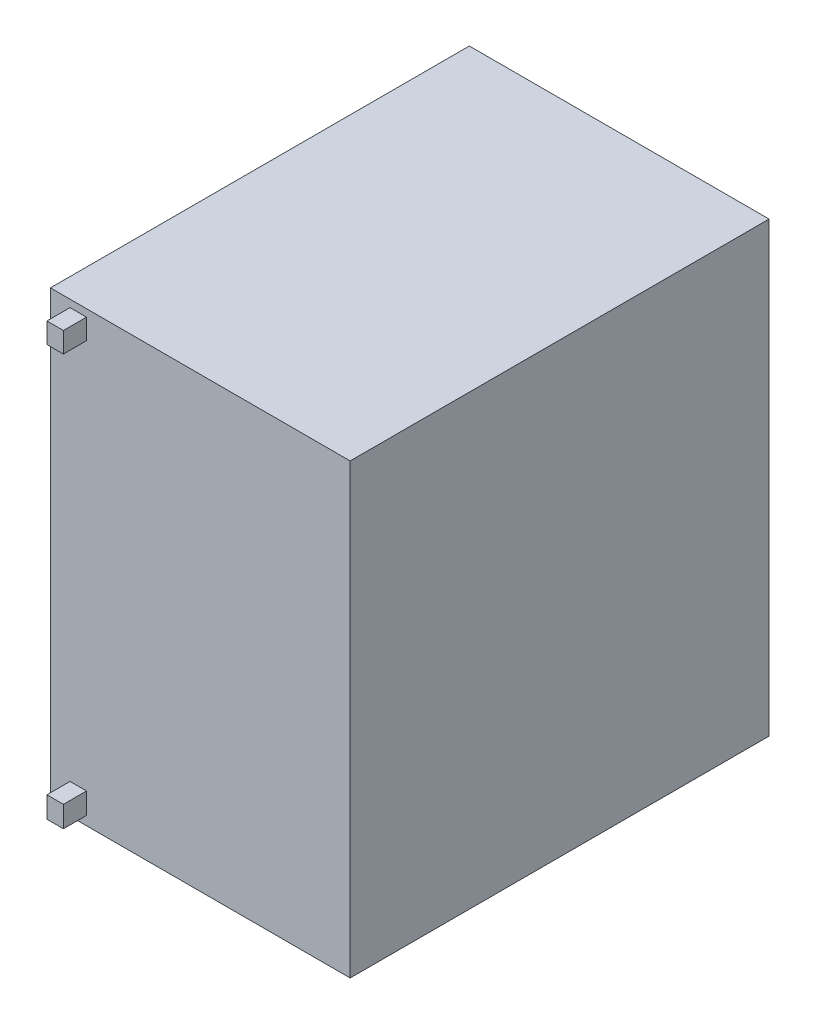
ISO-10303-21;
HEADER;
FILE_DESCRIPTION(('STEP AP214'),'2;1');
FILE_NAME('part.step','',(''),(''),'','','');
FILE_SCHEMA(('AUTOMOTIVE_DESIGN { 1 0 10303 214 1 1 1 1 }'));
ENDSEC;
DATA;
#1=APPLICATION_CONTEXT('core data for automotive mechanical design processes');
#2=APPLICATION_PROTOCOL_DEFINITION('international standard','automotive_design',2000,#1);
#3=PRODUCT_CONTEXT('',#1,'mechanical');
#4=PRODUCT('Part','Part','',(#3));
#5=PRODUCT_RELATED_PRODUCT_CATEGORY('part','',(#4));
#6=PRODUCT_DEFINITION_FORMATION('','',#4);
#7=PRODUCT_DEFINITION_CONTEXT('part definition',#1,'design');
#8=PRODUCT_DEFINITION('design','',#6,#7);
#9=PRODUCT_DEFINITION_SHAPE('','',#8);
#10=(LENGTH_UNIT() NAMED_UNIT(*) SI_UNIT(.MILLI.,.METRE.));
#11=(NAMED_UNIT(*) PLANE_ANGLE_UNIT() SI_UNIT($,.RADIAN.));
#12=(NAMED_UNIT(*) SI_UNIT($,.STERADIAN.) SOLID_ANGLE_UNIT());
#13=UNCERTAINTY_MEASURE_WITH_UNIT(LENGTH_MEASURE(1.E-05),#10,'distance_accuracy_value','');
#14=(GEOMETRIC_REPRESENTATION_CONTEXT(3) GLOBAL_UNCERTAINTY_ASSIGNED_CONTEXT((#13)) GLOBAL_UNIT_ASSIGNED_CONTEXT((#10,
#11,#12)) REPRESENTATION_CONTEXT('',''));
#15=CARTESIAN_POINT('',(0.,0.,0.));
#16=DIRECTION('',(0.,0.,1.));
#17=DIRECTION('',(1.,0.,0.));
#18=AXIS2_PLACEMENT_3D('',#15,#16,#17);
#19=CARTESIAN_POINT('',(118.999,-63.5,75.692));
#20=DIRECTION('',(0.,0.,-1.));
#21=DIRECTION('',(-1.,0.,0.));
#22=AXIS2_PLACEMENT_3D('',#19,#20,#21);
#23=PLANE('',#22);
#24=DIRECTION('',(0.,-1.,0.));
#25=VECTOR('',#24,1.);
#26=CARTESIAN_POINT('',(-4.13983068573411,-75.6791151301606,75.692));
#27=LINE('',#26,#25);
#28=CARTESIAN_POINT('',(-4.13983068573411,-66.7114378730985,75.692));
#29=VERTEX_POINT('',#28);
#30=CARTESIAN_POINT('',(-4.13983068573411,-75.6791151301606,75.692));
#31=VERTEX_POINT('',#30);
#32=EDGE_CURVE('E149',#29,#31,#27,.T.);
#33=ORIENTED_EDGE('',*,*,#32,.F.);
#34=DIRECTION('',(-1.,0.,0.));
#35=VECTOR('',#34,1.);
#36=CARTESIAN_POINT('',(-4.13983068573411,-66.7114378730985,75.692));
#37=LINE('',#36,#35);
#38=CARTESIAN_POINT('',(3.10329325266238,-66.7114378730985,75.692));
#39=VERTEX_POINT('',#38);
#40=EDGE_CURVE('E162',#39,#29,#37,.T.);
#41=ORIENTED_EDGE('',*,*,#40,.F.);
#42=DIRECTION('',(0.,1.,0.));
#43=VECTOR('',#42,1.);
#44=CARTESIAN_POINT('',(3.10329325266238,-75.6791151301606,75.692));
#45=LINE('',#44,#43);
#46=CARTESIAN_POINT('',(3.10329325266238,-75.6791151301606,75.692));
#47=VERTEX_POINT('',#46);
#48=EDGE_CURVE('E171',#47,#39,#45,.T.);
#49=ORIENTED_EDGE('',*,*,#48,.F.);
#50=DIRECTION('',(1.,0.,0.));
#51=VECTOR('',#50,1.);
#52=CARTESIAN_POINT('',(-4.13983068573411,-75.6791151301606,75.692));
#53=LINE('',#52,#51);
#54=EDGE_CURVE('E152',#31,#47,#53,.T.);
#55=ORIENTED_EDGE('',*,*,#54,.F.);
#56=EDGE_LOOP('',(#33,#41,#49,#55));
#57=FACE_BOUND('',#56,.T.);
#58=DIRECTION('',(1.,0.,0.));
#59=VECTOR('',#58,1.);
#60=CARTESIAN_POINT('',(118.999,-260.35,75.692));
#61=LINE('',#60,#59);
#62=CARTESIAN_POINT('',(-12.7635,-260.35,75.692));
#63=VERTEX_POINT('',#62);
#64=CARTESIAN_POINT('',(118.999,-260.35,75.692));
#65=VERTEX_POINT('',#64);
#66=EDGE_CURVE('E192',#63,#65,#61,.T.);
#67=ORIENTED_EDGE('',*,*,#66,.T.);
#68=DIRECTION('',(0.,-1.,0.));
#69=VECTOR('',#68,1.);
#70=CARTESIAN_POINT('',(118.999,-63.5,75.692));
#71=LINE('',#70,#69);
#72=CARTESIAN_POINT('',(118.999,-63.5,75.692));
#73=VERTEX_POINT('',#72);
#74=EDGE_CURVE('E198',#73,#65,#71,.T.);
#75=ORIENTED_EDGE('',*,*,#74,.F.);
#76=DIRECTION('',(1.,0.,0.));
#77=VECTOR('',#76,1.);
#78=CARTESIAN_POINT('',(118.999,-63.5,75.692));
#79=LINE('',#78,#77);
#80=CARTESIAN_POINT('',(-12.7635,-63.5,75.692));
#81=VERTEX_POINT('',#80);
#82=EDGE_CURVE('E196',#81,#73,#79,.T.);
#83=ORIENTED_EDGE('',*,*,#82,.F.);
#84=DIRECTION('',(0.,-1.,0.));
#85=VECTOR('',#84,1.);
#86=CARTESIAN_POINT('',(-12.7635,-63.5,75.692));
#87=LINE('',#86,#85);
#88=EDGE_CURVE('E208',#81,#63,#87,.T.);
#89=ORIENTED_EDGE('',*,*,#88,.T.);
#90=EDGE_LOOP('',(#67,#75,#83,#89));
#91=FACE_BOUND('',#90,.T.);
#92=DIRECTION('',(0.,-1.,0.));
#93=VECTOR('',#92,1.);
#94=CARTESIAN_POINT('',(-4.13983068573411,-256.412302926337,75.692));
#95=LINE('',#94,#93);
#96=CARTESIAN_POINT('',(-4.13983068573411,-247.099715005542,75.692));
#97=VERTEX_POINT('',#96);
#98=CARTESIAN_POINT('',(-4.13983068573411,-256.412302926337,75.692));
#99=VERTEX_POINT('',#98);
#100=EDGE_CURVE('E148',#97,#99,#95,.T.);
#101=ORIENTED_EDGE('',*,*,#100,.F.);
#102=DIRECTION('',(-1.,0.,0.));
#103=VECTOR('',#102,1.);
#104=CARTESIAN_POINT('',(-4.13983068573411,-247.099715005542,75.692));
#105=LINE('',#104,#103);
#106=CARTESIAN_POINT('',(3.10329325266238,-247.099715005542,75.692));
#107=VERTEX_POINT('',#106);
#108=EDGE_CURVE('E145',#107,#97,#105,.T.);
#109=ORIENTED_EDGE('',*,*,#108,.F.);
#110=DIRECTION('',(0.,1.,0.));
#111=VECTOR('',#110,1.);
#112=CARTESIAN_POINT('',(3.10329325266238,-256.412302926337,75.692));
#113=LINE('',#112,#111);
#114=CARTESIAN_POINT('',(3.10329325266238,-256.412302926337,75.692));
#115=VERTEX_POINT('',#114);
#116=EDGE_CURVE('E59',#115,#107,#113,.T.);
#117=ORIENTED_EDGE('',*,*,#116,.F.);
#118=DIRECTION('',(1.,0.,0.));
#119=VECTOR('',#118,1.);
#120=CARTESIAN_POINT('',(-4.13983068573411,-256.412302926337,75.692));
#121=LINE('',#120,#119);
#122=EDGE_CURVE('E54',#99,#115,#121,.T.);
#123=ORIENTED_EDGE('',*,*,#122,.F.);
#124=EDGE_LOOP('',(#101,#109,#117,#123));
#125=FACE_BOUND('',#124,.T.);
#126=ADVANCED_FACE('F39',(#57,#91,#125),#23,.F.);
#127=CARTESIAN_POINT('',(118.999,-63.5,-108.458));
#128=DIRECTION('',(-1.,0.,0.));
#129=DIRECTION('',(0.,0.,1.));
#130=AXIS2_PLACEMENT_3D('',#127,#128,#129);
#131=PLANE('',#130);
#132=DIRECTION('',(0.,0.,-1.));
#133=VECTOR('',#132,1.);
#134=CARTESIAN_POINT('',(118.999,-260.35,-108.458));
#135=LINE('',#134,#133);
#136=CARTESIAN_POINT('',(118.999,-260.35,-108.458));
#137=VERTEX_POINT('',#136);
#138=EDGE_CURVE('E187',#65,#137,#135,.T.);
#139=ORIENTED_EDGE('',*,*,#138,.T.);
#140=DIRECTION('',(0.,-1.,0.));
#141=VECTOR('',#140,1.);
#142=CARTESIAN_POINT('',(118.999,-63.5,-108.458));
#143=LINE('',#142,#141);
#144=CARTESIAN_POINT('',(118.999,-63.5,-108.458));
#145=VERTEX_POINT('',#144);
#146=EDGE_CURVE('E11',#145,#137,#143,.T.);
#147=ORIENTED_EDGE('',*,*,#146,.F.);
#148=DIRECTION('',(0.,0.,-1.));
#149=VECTOR('',#148,1.);
#150=CARTESIAN_POINT('',(118.999,-63.5,-108.458));
#151=LINE('',#150,#149);
#152=EDGE_CURVE('E188',#73,#145,#151,.T.);
#153=ORIENTED_EDGE('',*,*,#152,.F.);
#154=ORIENTED_EDGE('',*,*,#74,.T.);
#155=EDGE_LOOP('',(#139,#147,#153,#154));
#156=FACE_BOUND('',#155,.T.);
#157=ADVANCED_FACE('F41',(#156),#131,.F.);
#158=CARTESIAN_POINT('',(118.999,-63.5,-108.458));
#159=DIRECTION('',(0.,0.,1.));
#160=DIRECTION('',(1.,0.,0.));
#161=AXIS2_PLACEMENT_3D('',#158,#159,#160);
#162=PLANE('',#161);
#163=DIRECTION('',(-1.,0.,0.));
#164=VECTOR('',#163,1.);
#165=CARTESIAN_POINT('',(118.999,-260.35,-108.458));
#166=LINE('',#165,#164);
#167=CARTESIAN_POINT('',(-12.7635,-260.35,-108.458));
#168=VERTEX_POINT('',#167);
#169=EDGE_CURVE('E201',#137,#168,#166,.T.);
#170=ORIENTED_EDGE('',*,*,#169,.T.);
#171=DIRECTION('',(0.,-1.,0.));
#172=VECTOR('',#171,1.);
#173=CARTESIAN_POINT('',(-12.7635,-63.5,-108.458));
#174=LINE('',#173,#172);
#175=CARTESIAN_POINT('',(-12.7635,-63.5,-108.458));
#176=VERTEX_POINT('',#175);
#177=EDGE_CURVE('E47',#176,#168,#174,.T.);
#178=ORIENTED_EDGE('',*,*,#177,.F.);
#179=DIRECTION('',(-1.,0.,0.));
#180=VECTOR('',#179,1.);
#181=CARTESIAN_POINT('',(118.999,-63.5,-108.458));
#182=LINE('',#181,#180);
#183=EDGE_CURVE('E191',#145,#176,#182,.T.);
#184=ORIENTED_EDGE('',*,*,#183,.F.);
#185=ORIENTED_EDGE('',*,*,#146,.T.);
#186=EDGE_LOOP('',(#170,#178,#184,#185));
#187=FACE_BOUND('',#186,.T.);
#188=ADVANCED_FACE('F230',(#187),#162,.F.);
#189=CARTESIAN_POINT('',(-12.7635,-63.5,-108.458));
#190=DIRECTION('',(1.,0.,0.));
#191=DIRECTION('',(0.,0.,-1.));
#192=AXIS2_PLACEMENT_3D('',#189,#190,#191);
#193=PLANE('',#192);
#194=DIRECTION('',(0.,0.,1.));
#195=VECTOR('',#194,1.);
#196=CARTESIAN_POINT('',(-12.7635,-260.35,-108.458));
#197=LINE('',#196,#195);
#198=EDGE_CURVE('E203',#168,#63,#197,.T.);
#199=ORIENTED_EDGE('',*,*,#198,.T.);
#200=ORIENTED_EDGE('',*,*,#88,.F.);
#201=DIRECTION('',(0.,0.,1.));
#202=VECTOR('',#201,1.);
#203=CARTESIAN_POINT('',(-12.7635,-63.5,-108.458));
#204=LINE('',#203,#202);
#205=EDGE_CURVE('E194',#176,#81,#204,.T.);
#206=ORIENTED_EDGE('',*,*,#205,.F.);
#207=ORIENTED_EDGE('',*,*,#177,.T.);
#208=EDGE_LOOP('',(#199,#200,#206,#207));
#209=FACE_BOUND('',#208,.T.);
#210=ADVANCED_FACE('F215',(#209),#193,.F.);
#211=CARTESIAN_POINT('',(118.999,-63.5,-108.458));
#212=DIRECTION('',(0.,-1.,0.));
#213=DIRECTION('',(0.,0.,-1.));
#214=AXIS2_PLACEMENT_3D('',#211,#212,#213);
#215=PLANE('',#214);
#216=ORIENTED_EDGE('',*,*,#152,.T.);
#217=ORIENTED_EDGE('',*,*,#183,.T.);
#218=ORIENTED_EDGE('',*,*,#205,.T.);
#219=ORIENTED_EDGE('',*,*,#82,.T.);
#220=EDGE_LOOP('',(#216,#217,#218,#219));
#221=FACE_BOUND('',#220,.T.);
#222=ADVANCED_FACE('F229',(#221),#215,.F.);
#223=CARTESIAN_POINT('',(118.999,-260.35,-108.458));
#224=DIRECTION('',(0.,-1.,0.));
#225=DIRECTION('',(0.,0.,-1.));
#226=AXIS2_PLACEMENT_3D('',#223,#224,#225);
#227=PLANE('',#226);
#228=ORIENTED_EDGE('',*,*,#138,.F.);
#229=ORIENTED_EDGE('',*,*,#66,.F.);
#230=ORIENTED_EDGE('',*,*,#198,.F.);
#231=ORIENTED_EDGE('',*,*,#169,.F.);
#232=EDGE_LOOP('',(#228,#229,#230,#231));
#233=FACE_BOUND('',#232,.T.);
#234=ADVANCED_FACE('F221',(#233),#227,.T.);
#235=CARTESIAN_POINT('',(-4.13983068573411,-75.6791151301606,85.852));
#236=DIRECTION('',(1.,0.,0.));
#237=DIRECTION('',(0.,0.,-1.));
#238=AXIS2_PLACEMENT_3D('',#235,#236,#237);
#239=PLANE('',#238);
#240=ORIENTED_EDGE('',*,*,#32,.T.);
#241=DIRECTION('',(0.,0.,-1.));
#242=VECTOR('',#241,1.);
#243=CARTESIAN_POINT('',(-4.13983068573411,-75.6791151301606,85.852));
#244=LINE('',#243,#242);
#245=CARTESIAN_POINT('',(-4.13983068573411,-75.6791151301606,85.852));
#246=VERTEX_POINT('',#245);
#247=EDGE_CURVE('E184',#246,#31,#244,.T.);
#248=ORIENTED_EDGE('',*,*,#247,.F.);
#249=DIRECTION('',(0.,-1.,0.));
#250=VECTOR('',#249,1.);
#251=CARTESIAN_POINT('',(-4.13983068573411,-75.6791151301606,85.852));
#252=LINE('',#251,#250);
#253=CARTESIAN_POINT('',(-4.13983068573411,-66.7114378730985,85.852));
#254=VERTEX_POINT('',#253);
#255=EDGE_CURVE('E158',#254,#246,#252,.T.);
#256=ORIENTED_EDGE('',*,*,#255,.F.);
#257=DIRECTION('',(0.,0.,-1.));
#258=VECTOR('',#257,1.);
#259=CARTESIAN_POINT('',(-4.13983068573411,-66.7114378730985,85.852));
#260=LINE('',#259,#258);
#261=EDGE_CURVE('E167',#254,#29,#260,.T.);
#262=ORIENTED_EDGE('',*,*,#261,.T.);
#263=EDGE_LOOP('',(#240,#248,#256,#262));
#264=FACE_BOUND('',#263,.T.);
#265=ADVANCED_FACE('F245',(#264),#239,.F.);
#266=CARTESIAN_POINT('',(-4.13983068573411,-75.6791151301606,85.852));
#267=DIRECTION('',(0.,1.,0.));
#268=DIRECTION('',(0.,0.,1.));
#269=AXIS2_PLACEMENT_3D('',#266,#267,#268);
#270=PLANE('',#269);
#271=ORIENTED_EDGE('',*,*,#54,.T.);
#272=DIRECTION('',(0.,0.,-1.));
#273=VECTOR('',#272,1.);
#274=CARTESIAN_POINT('',(3.10329325266238,-75.6791151301606,85.852));
#275=LINE('',#274,#273);
#276=CARTESIAN_POINT('',(3.10329325266238,-75.6791151301606,85.852));
#277=VERTEX_POINT('',#276);
#278=EDGE_CURVE('E181',#277,#47,#275,.T.);
#279=ORIENTED_EDGE('',*,*,#278,.F.);
#280=DIRECTION('',(1.,0.,0.));
#281=VECTOR('',#280,1.);
#282=CARTESIAN_POINT('',(-4.13983068573411,-75.6791151301606,85.852));
#283=LINE('',#282,#281);
#284=EDGE_CURVE('E161',#246,#277,#283,.T.);
#285=ORIENTED_EDGE('',*,*,#284,.F.);
#286=ORIENTED_EDGE('',*,*,#247,.T.);
#287=EDGE_LOOP('',(#271,#279,#285,#286));
#288=FACE_BOUND('',#287,.T.);
#289=ADVANCED_FACE('F250',(#288),#270,.F.);
#290=CARTESIAN_POINT('',(3.10329325266238,-75.6791151301606,85.852));
#291=DIRECTION('',(-1.,0.,0.));
#292=DIRECTION('',(0.,0.,1.));
#293=AXIS2_PLACEMENT_3D('',#290,#291,#292);
#294=PLANE('',#293);
#295=ORIENTED_EDGE('',*,*,#48,.T.);
#296=DIRECTION('',(0.,0.,-1.));
#297=VECTOR('',#296,1.);
#298=CARTESIAN_POINT('',(3.10329325266238,-66.7114378730985,85.852));
#299=LINE('',#298,#297);
#300=CARTESIAN_POINT('',(3.10329325266238,-66.7114378730985,85.852));
#301=VERTEX_POINT('',#300);
#302=EDGE_CURVE('E178',#301,#39,#299,.T.);
#303=ORIENTED_EDGE('',*,*,#302,.F.);
#304=DIRECTION('',(0.,1.,0.));
#305=VECTOR('',#304,1.);
#306=CARTESIAN_POINT('',(3.10329325266238,-75.6791151301606,85.852));
#307=LINE('',#306,#305);
#308=EDGE_CURVE('E164',#277,#301,#307,.T.);
#309=ORIENTED_EDGE('',*,*,#308,.F.);
#310=ORIENTED_EDGE('',*,*,#278,.T.);
#311=EDGE_LOOP('',(#295,#303,#309,#310));
#312=FACE_BOUND('',#311,.T.);
#313=ADVANCED_FACE('F254',(#312),#294,.F.);
#314=CARTESIAN_POINT('',(-4.13983068573411,-66.7114378730985,85.852));
#315=DIRECTION('',(0.,-1.,0.));
#316=DIRECTION('',(0.,0.,-1.));
#317=AXIS2_PLACEMENT_3D('',#314,#315,#316);
#318=PLANE('',#317);
#319=ORIENTED_EDGE('',*,*,#40,.T.);
#320=ORIENTED_EDGE('',*,*,#261,.F.);
#321=DIRECTION('',(-1.,0.,0.));
#322=VECTOR('',#321,1.);
#323=CARTESIAN_POINT('',(-4.13983068573411,-66.7114378730985,85.852));
#324=LINE('',#323,#322);
#325=EDGE_CURVE('E166',#301,#254,#324,.T.);
#326=ORIENTED_EDGE('',*,*,#325,.F.);
#327=ORIENTED_EDGE('',*,*,#302,.T.);
#328=EDGE_LOOP('',(#319,#320,#326,#327));
#329=FACE_BOUND('',#328,.T.);
#330=ADVANCED_FACE('F258',(#329),#318,.F.);
#331=CARTESIAN_POINT('',(0.,0.,85.852));
#332=DIRECTION('',(0.,0.,-1.));
#333=DIRECTION('',(-1.,0.,0.));
#334=AXIS2_PLACEMENT_3D('',#331,#332,#333);
#335=PLANE('',#334);
#336=ORIENTED_EDGE('',*,*,#255,.T.);
#337=ORIENTED_EDGE('',*,*,#284,.T.);
#338=ORIENTED_EDGE('',*,*,#308,.T.);
#339=ORIENTED_EDGE('',*,*,#325,.T.);
#340=EDGE_LOOP('',(#336,#337,#338,#339));
#341=FACE_BOUND('',#340,.T.);
#342=ADVANCED_FACE('F262',(#341),#335,.F.);
#343=CARTESIAN_POINT('',(-4.13983068573411,-256.412302926337,85.852));
#344=DIRECTION('',(1.,0.,0.));
#345=DIRECTION('',(0.,0.,-1.));
#346=AXIS2_PLACEMENT_3D('',#343,#344,#345);
#347=PLANE('',#346);
#348=ORIENTED_EDGE('',*,*,#100,.T.);
#349=DIRECTION('',(0.,0.,-1.));
#350=VECTOR('',#349,1.);
#351=CARTESIAN_POINT('',(-4.13983068573411,-256.412302926337,85.852));
#352=LINE('',#351,#350);
#353=CARTESIAN_POINT('',(-4.13983068573411,-256.412302926337,85.852));
#354=VERTEX_POINT('',#353);
#355=EDGE_CURVE('E129',#354,#99,#352,.T.);
#356=ORIENTED_EDGE('',*,*,#355,.F.);
#357=DIRECTION('',(0.,-1.,0.));
#358=VECTOR('',#357,1.);
#359=CARTESIAN_POINT('',(-4.13983068573411,-256.412302926337,85.852));
#360=LINE('',#359,#358);
#361=CARTESIAN_POINT('',(-4.13983068573411,-247.099715005542,85.852));
#362=VERTEX_POINT('',#361);
#363=EDGE_CURVE('E136',#362,#354,#360,.T.);
#364=ORIENTED_EDGE('',*,*,#363,.F.);
#365=DIRECTION('',(0.,0.,-1.));
#366=VECTOR('',#365,1.);
#367=CARTESIAN_POINT('',(-4.13983068573411,-247.099715005542,85.852));
#368=LINE('',#367,#366);
#369=EDGE_CURVE('E406',#362,#97,#368,.T.);
#370=ORIENTED_EDGE('',*,*,#369,.T.);
#371=EDGE_LOOP('',(#348,#356,#364,#370));
#372=FACE_BOUND('',#371,.T.);
#373=ADVANCED_FACE('F147',(#372),#347,.F.);
#374=CARTESIAN_POINT('',(-4.13983068573411,-256.412302926337,85.852));
#375=DIRECTION('',(0.,1.,0.));
#376=DIRECTION('',(0.,0.,1.));
#377=AXIS2_PLACEMENT_3D('',#374,#375,#376);
#378=PLANE('',#377);
#379=ORIENTED_EDGE('',*,*,#122,.T.);
#380=DIRECTION('',(0.,0.,-1.));
#381=VECTOR('',#380,1.);
#382=CARTESIAN_POINT('',(3.10329325266238,-256.412302926337,85.852));
#383=LINE('',#382,#381);
#384=CARTESIAN_POINT('',(3.10329325266238,-256.412302926337,85.852));
#385=VERTEX_POINT('',#384);
#386=EDGE_CURVE('E132',#385,#115,#383,.T.);
#387=ORIENTED_EDGE('',*,*,#386,.F.);
#388=DIRECTION('',(1.,0.,0.));
#389=VECTOR('',#388,1.);
#390=CARTESIAN_POINT('',(-4.13983068573411,-256.412302926337,85.852));
#391=LINE('',#390,#389);
#392=EDGE_CURVE('E125',#354,#385,#391,.T.);
#393=ORIENTED_EDGE('',*,*,#392,.F.);
#394=ORIENTED_EDGE('',*,*,#355,.T.);
#395=EDGE_LOOP('',(#379,#387,#393,#394));
#396=FACE_BOUND('',#395,.T.);
#397=ADVANCED_FACE('F127',(#396),#378,.F.);
#398=CARTESIAN_POINT('',(3.10329325266238,-256.412302926337,85.852));
#399=DIRECTION('',(-1.,0.,0.));
#400=DIRECTION('',(0.,0.,1.));
#401=AXIS2_PLACEMENT_3D('',#398,#399,#400);
#402=PLANE('',#401);
#403=ORIENTED_EDGE('',*,*,#116,.T.);
#404=DIRECTION('',(0.,0.,-1.));
#405=VECTOR('',#404,1.);
#406=CARTESIAN_POINT('',(3.10329325266238,-247.099715005542,85.852));
#407=LINE('',#406,#405);
#408=CARTESIAN_POINT('',(3.10329325266238,-247.099715005542,85.852));
#409=VERTEX_POINT('',#408);
#410=EDGE_CURVE('E154',#409,#107,#407,.T.);
#411=ORIENTED_EDGE('',*,*,#410,.F.);
#412=DIRECTION('',(0.,1.,0.));
#413=VECTOR('',#412,1.);
#414=CARTESIAN_POINT('',(3.10329325266238,-256.412302926337,85.852));
#415=LINE('',#414,#413);
#416=EDGE_CURVE('E135',#385,#409,#415,.T.);
#417=ORIENTED_EDGE('',*,*,#416,.F.);
#418=ORIENTED_EDGE('',*,*,#386,.T.);
#419=EDGE_LOOP('',(#403,#411,#417,#418));
#420=FACE_BOUND('',#419,.T.);
#421=ADVANCED_FACE('F271',(#420),#402,.F.);
#422=CARTESIAN_POINT('',(-4.13983068573411,-247.099715005542,85.852));
#423=DIRECTION('',(0.,-1.,0.));
#424=DIRECTION('',(0.,0.,-1.));
#425=AXIS2_PLACEMENT_3D('',#422,#423,#424);
#426=PLANE('',#425);
#427=ORIENTED_EDGE('',*,*,#108,.T.);
#428=ORIENTED_EDGE('',*,*,#369,.F.);
#429=DIRECTION('',(-1.,0.,0.));
#430=VECTOR('',#429,1.);
#431=CARTESIAN_POINT('',(-4.13983068573411,-247.099715005542,85.852));
#432=LINE('',#431,#430);
#433=EDGE_CURVE('E141',#409,#362,#432,.T.);
#434=ORIENTED_EDGE('',*,*,#433,.F.);
#435=ORIENTED_EDGE('',*,*,#410,.T.);
#436=EDGE_LOOP('',(#427,#428,#434,#435));
#437=FACE_BOUND('',#436,.T.);
#438=ADVANCED_FACE('F274',(#437),#426,.F.);
#439=CARTESIAN_POINT('',(0.,0.,85.852));
#440=DIRECTION('',(0.,0.,-1.));
#441=DIRECTION('',(-1.,0.,0.));
#442=AXIS2_PLACEMENT_3D('',#439,#440,#441);
#443=PLANE('',#442);
#444=ORIENTED_EDGE('',*,*,#363,.T.);
#445=ORIENTED_EDGE('',*,*,#392,.T.);
#446=ORIENTED_EDGE('',*,*,#416,.T.);
#447=ORIENTED_EDGE('',*,*,#433,.T.);
#448=EDGE_LOOP('',(#444,#445,#446,#447));
#449=FACE_BOUND('',#448,.T.);
#450=ADVANCED_FACE('F139',(#449),#443,.F.);
#451=CLOSED_SHELL('',(#126,#157,#188,#210,#222,#234,#265,#289,#313,#330,#342,#373,#397,#421,
#438,#450));
#452=MANIFOLD_SOLID_BREP('B2',#451);
#453=ADVANCED_BREP_SHAPE_REPRESENTATION('',(#18,#452),#14);
#454=SHAPE_DEFINITION_REPRESENTATION(#9,#453);
ENDSEC;
END-ISO-10303-21;
